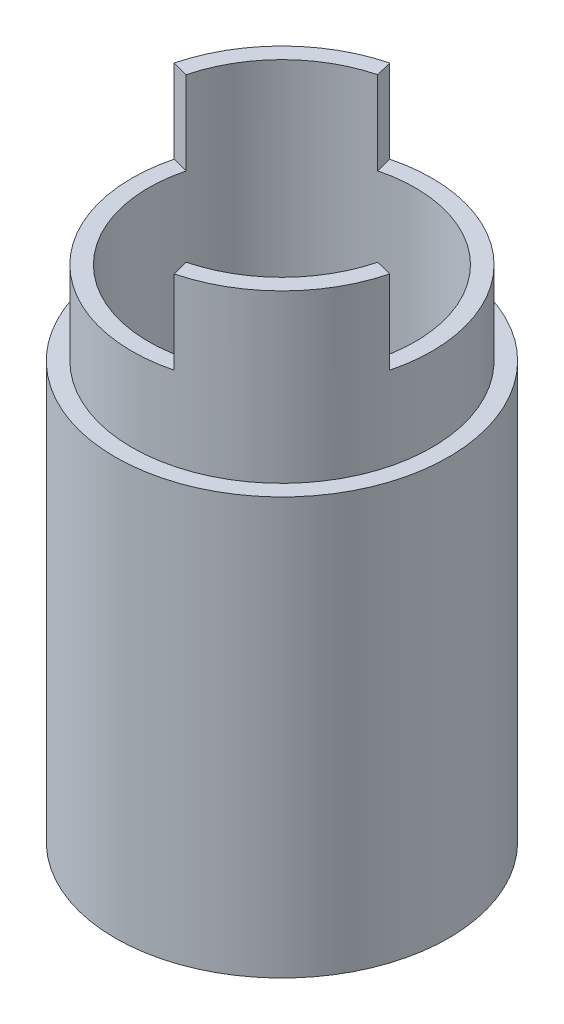
ISO-10303-21;
HEADER;
FILE_DESCRIPTION(('STEP AP214'),'2;1');
FILE_NAME('part.step','',(''),(''),'','','');
FILE_SCHEMA(('AUTOMOTIVE_DESIGN { 1 0 10303 214 1 1 1 1 }'));
ENDSEC;
DATA;
#1=APPLICATION_CONTEXT('core data for automotive mechanical design processes');
#2=APPLICATION_PROTOCOL_DEFINITION('international standard','automotive_design',2000,#1);
#3=PRODUCT_CONTEXT('',#1,'mechanical');
#4=PRODUCT('Part','Part','',(#3));
#5=PRODUCT_RELATED_PRODUCT_CATEGORY('part','',(#4));
#6=PRODUCT_DEFINITION_FORMATION('','',#4);
#7=PRODUCT_DEFINITION_CONTEXT('part definition',#1,'design');
#8=PRODUCT_DEFINITION('design','',#6,#7);
#9=PRODUCT_DEFINITION_SHAPE('','',#8);
#10=(LENGTH_UNIT() NAMED_UNIT(*) SI_UNIT(.MILLI.,.METRE.));
#11=(NAMED_UNIT(*) PLANE_ANGLE_UNIT() SI_UNIT($,.RADIAN.));
#12=(NAMED_UNIT(*) SI_UNIT($,.STERADIAN.) SOLID_ANGLE_UNIT());
#13=UNCERTAINTY_MEASURE_WITH_UNIT(LENGTH_MEASURE(1.E-05),#10,'distance_accuracy_value','');
#14=(GEOMETRIC_REPRESENTATION_CONTEXT(3) GLOBAL_UNCERTAINTY_ASSIGNED_CONTEXT((#13)) GLOBAL_UNIT_ASSIGNED_CONTEXT((#10,
#11,#12)) REPRESENTATION_CONTEXT('',''));
#15=CARTESIAN_POINT('',(0.,0.,0.));
#16=DIRECTION('',(0.,0.,1.));
#17=DIRECTION('',(1.,0.,0.));
#18=AXIS2_PLACEMENT_3D('',#15,#16,#17);
#19=CARTESIAN_POINT('',(0.,60.,0.));
#20=DIRECTION('',(0.,1.,0.));
#21=DIRECTION('',(0.,0.,1.));
#22=AXIS2_PLACEMENT_3D('',#19,#20,#21);
#23=PLANE('',#22);
#24=CARTESIAN_POINT('',(0.,60.,0.));
#25=DIRECTION('',(0.,1.,0.));
#26=DIRECTION('',(0.,0.,1.));
#27=AXIS2_PLACEMENT_3D('',#24,#25,#26);
#28=CIRCLE('',#27,18.);
#29=CARTESIAN_POINT('',(-17.4284250579316,60.,-4.50000000000688));
#30=VERTEX_POINT('',#29);
#31=CARTESIAN_POINT('',(4.49999999999662,60.,17.4284250579342));
#32=VERTEX_POINT('',#31);
#33=EDGE_CURVE('E181',#30,#32,#28,.T.);
#34=ORIENTED_EDGE('',*,*,#33,.T.);
#35=DIRECTION('',(0.249999999999812,0.,0.968245836551903));
#36=VECTOR('',#35,1.);
#37=CARTESIAN_POINT('',(0.,60.,0.));
#38=LINE('',#37,#36);
#39=CARTESIAN_POINT('',(3.999999999997,60.,15.4919333848304));
#40=VERTEX_POINT('',#39);
#41=EDGE_CURVE('E63',#40,#32,#38,.T.);
#42=ORIENTED_EDGE('',*,*,#41,.F.);
#43=CARTESIAN_POINT('',(0.,60.,0.));
#44=DIRECTION('',(0.,1.,0.));
#45=DIRECTION('',(0.,0.,1.));
#46=AXIS2_PLACEMENT_3D('',#43,#44,#45);
#47=CIRCLE('',#46,16.);
#48=CARTESIAN_POINT('',(-15.4919333848297,60.,-4.));
#49=VERTEX_POINT('',#48);
#50=EDGE_CURVE('E177',#49,#40,#47,.T.);
#51=ORIENTED_EDGE('',*,*,#50,.F.);
#52=DIRECTION('',(-0.968245836550966,0.,-0.25000000000344));
#53=VECTOR('',#52,1.);
#54=CARTESIAN_POINT('',(-1.4211071555832E-11,60.,5.50392434666916E-11));
#55=LINE('',#54,#53);
#56=EDGE_CURVE('E139',#49,#30,#55,.T.);
#57=ORIENTED_EDGE('',*,*,#56,.T.);
#58=EDGE_LOOP('',(#34,#42,#51,#57));
#59=FACE_BOUND('',#58,.T.);
#60=ADVANCED_FACE('F39',(#59),#23,.T.);
#61=DIRECTION('',(0.968245836551854,0.,0.25));
#62=VECTOR('',#61,1.);
#63=CARTESIAN_POINT('',(0.,60.,0.));
#64=LINE('',#63,#62);
#65=CARTESIAN_POINT('',(15.4919333848297,60.,4.));
#66=VERTEX_POINT('',#65);
#67=CARTESIAN_POINT('',(17.4284250579352,60.,4.50000000000046));
#68=VERTEX_POINT('',#67);
#69=EDGE_CURVE('E131',#66,#68,#64,.T.);
#70=ORIENTED_EDGE('',*,*,#69,.T.);
#71=CARTESIAN_POINT('',(-4.49999999998974,60.,-17.428425057936));
#72=VERTEX_POINT('',#71);
#73=EDGE_CURVE('E185',#68,#72,#28,.T.);
#74=ORIENTED_EDGE('',*,*,#73,.T.);
#75=DIRECTION('',(0.249999999996372,0.,0.968245836552791));
#76=VECTOR('',#75,1.);
#77=CARTESIAN_POINT('',(-5.50442823831449E-11,60.,1.42123725980372E-11));
#78=LINE('',#77,#76);
#79=CARTESIAN_POINT('',(-3.99999999999657,60.,-15.4919333848288));
#80=VERTEX_POINT('',#79);
#81=EDGE_CURVE('E135',#72,#80,#78,.T.);
#82=ORIENTED_EDGE('',*,*,#81,.T.);
#83=EDGE_CURVE('E55',#66,#80,#47,.T.);
#84=ORIENTED_EDGE('',*,*,#83,.F.);
#85=EDGE_LOOP('',(#70,#74,#82,#84));
#86=FACE_BOUND('',#85,.T.);
#87=ADVANCED_FACE('F207',(#86),#23,.T.);
#88=CARTESIAN_POINT('',(0.,50.,0.));
#89=DIRECTION('',(0.,1.,0.));
#90=DIRECTION('',(0.,0.,1.));
#91=AXIS2_PLACEMENT_3D('',#88,#89,#90);
#92=PLANE('',#91);
#93=CARTESIAN_POINT('',(0.,50.,0.));
#94=DIRECTION('',(0.,1.,0.));
#95=DIRECTION('',(0.,0.,1.));
#96=AXIS2_PLACEMENT_3D('',#93,#94,#95);
#97=CIRCLE('',#96,20.);
#98=CARTESIAN_POINT('',(0.,50.,20.));
#99=VERTEX_POINT('',#98);
#100=EDGE_CURVE('E11',#99,#99,#97,.T.);
#101=ORIENTED_EDGE('',*,*,#100,.T.);
#102=EDGE_LOOP('',(#101));
#103=FACE_BOUND('',#102,.T.);
#104=CARTESIAN_POINT('',(0.,50.,0.));
#105=DIRECTION('',(0.,1.,0.));
#106=DIRECTION('',(0.,0.,1.));
#107=AXIS2_PLACEMENT_3D('',#104,#105,#106);
#108=CIRCLE('',#107,18.);
#109=CARTESIAN_POINT('',(0.,50.,18.));
#110=VERTEX_POINT('',#109);
#111=EDGE_CURVE('E180',#110,#110,#108,.T.);
#112=ORIENTED_EDGE('',*,*,#111,.F.);
#113=EDGE_LOOP('',(#112));
#114=FACE_BOUND('',#113,.T.);
#115=ADVANCED_FACE('F200',(#103,#114),#92,.T.);
#116=CARTESIAN_POINT('',(0.,0.,0.));
#117=DIRECTION('',(0.,1.,0.));
#118=DIRECTION('',(0.,0.,1.));
#119=AXIS2_PLACEMENT_3D('',#116,#117,#118);
#120=PLANE('',#119);
#121=CARTESIAN_POINT('',(0.,0.,0.));
#122=DIRECTION('',(0.,1.,0.));
#123=DIRECTION('',(0.,0.,1.));
#124=AXIS2_PLACEMENT_3D('',#121,#122,#123);
#125=CIRCLE('',#124,20.);
#126=CARTESIAN_POINT('',(0.,0.,20.));
#127=VERTEX_POINT('',#126);
#128=EDGE_CURVE('E43',#127,#127,#125,.T.);
#129=ORIENTED_EDGE('',*,*,#128,.F.);
#130=EDGE_LOOP('',(#129));
#131=FACE_BOUND('',#130,.T.);
#132=CARTESIAN_POINT('',(0.,0.,0.));
#133=DIRECTION('',(0.,1.,0.));
#134=DIRECTION('',(0.,0.,1.));
#135=AXIS2_PLACEMENT_3D('',#132,#133,#134);
#136=CIRCLE('',#135,16.);
#137=CARTESIAN_POINT('',(0.,0.,16.));
#138=VERTEX_POINT('',#137);
#139=EDGE_CURVE('E184',#138,#138,#136,.T.);
#140=ORIENTED_EDGE('',*,*,#139,.T.);
#141=EDGE_LOOP('',(#140));
#142=FACE_BOUND('',#141,.T.);
#143=ADVANCED_FACE('F198',(#131,#142),#120,.F.);
#144=CARTESIAN_POINT('',(0.,50.,0.));
#145=DIRECTION('',(0.,-1.,0.));
#146=DIRECTION('',(0.,0.,-1.));
#147=AXIS2_PLACEMENT_3D('',#144,#145,#146);
#148=CYLINDRICAL_SURFACE('',#147,20.);
#149=ORIENTED_EDGE('',*,*,#100,.F.);
#150=EDGE_LOOP('',(#149));
#151=FACE_BOUND('',#150,.T.);
#152=ORIENTED_EDGE('',*,*,#128,.T.);
#153=EDGE_LOOP('',(#152));
#154=FACE_BOUND('',#153,.T.);
#155=ADVANCED_FACE('F41',(#151,#154),#148,.T.);
#156=CARTESIAN_POINT('',(0.,50.,0.));
#157=DIRECTION('',(0.,-1.,0.));
#158=DIRECTION('',(0.,0.,-1.));
#159=AXIS2_PLACEMENT_3D('',#156,#157,#158);
#160=CYLINDRICAL_SURFACE('',#159,16.);
#161=ORIENTED_EDGE('',*,*,#139,.F.);
#162=EDGE_LOOP('',(#161));
#163=FACE_BOUND('',#162,.T.);
#164=ORIENTED_EDGE('',*,*,#50,.T.);
#165=DIRECTION('',(0.,-1.,0.));
#166=VECTOR('',#165,1.);
#167=CARTESIAN_POINT('',(3.99999999999654,70.,15.4919333848287));
#168=LINE('',#167,#166);
#169=CARTESIAN_POINT('',(3.99999999999654,70.,15.4919333848287));
#170=VERTEX_POINT('',#169);
#171=EDGE_CURVE('E228',#170,#40,#168,.T.);
#172=ORIENTED_EDGE('',*,*,#171,.F.);
#173=CARTESIAN_POINT('',(0.,70.,0.));
#174=DIRECTION('',(0.,1.,0.));
#175=DIRECTION('',(0.,0.,1.));
#176=AXIS2_PLACEMENT_3D('',#173,#174,#175);
#177=CIRCLE('',#176,16.);
#178=CARTESIAN_POINT('',(15.4919333848314,70.,4.00000000000046));
#179=VERTEX_POINT('',#178);
#180=EDGE_CURVE('E127',#170,#179,#177,.T.);
#181=ORIENTED_EDGE('',*,*,#180,.T.);
#182=DIRECTION('',(0.,-1.,0.));
#183=VECTOR('',#182,1.);
#184=CARTESIAN_POINT('',(15.4919333848314,70.,4.00000000000046));
#185=LINE('',#184,#183);
#186=EDGE_CURVE('E141',#179,#66,#185,.T.);
#187=ORIENTED_EDGE('',*,*,#186,.T.);
#188=ORIENTED_EDGE('',*,*,#83,.T.);
#189=DIRECTION('',(0.,-1.,0.));
#190=VECTOR('',#189,1.);
#191=CARTESIAN_POINT('',(-3.99999999999657,70.,-15.4919333848288));
#192=LINE('',#191,#190);
#193=CARTESIAN_POINT('',(-3.99999999999657,70.,-15.4919333848288));
#194=VERTEX_POINT('',#193);
#195=EDGE_CURVE('E159',#194,#80,#192,.T.);
#196=ORIENTED_EDGE('',*,*,#195,.F.);
#197=CARTESIAN_POINT('',(0.,70.,0.));
#198=DIRECTION('',(0.,1.,0.));
#199=DIRECTION('',(0.,0.,1.));
#200=AXIS2_PLACEMENT_3D('',#197,#198,#199);
#201=CIRCLE('',#200,16.);
#202=CARTESIAN_POINT('',(-15.4919333848297,70.,-4.));
#203=VERTEX_POINT('',#202);
#204=EDGE_CURVE('E156',#194,#203,#201,.T.);
#205=ORIENTED_EDGE('',*,*,#204,.T.);
#206=DIRECTION('',(0.,-1.,0.));
#207=VECTOR('',#206,1.);
#208=CARTESIAN_POINT('',(-15.4919333848297,70.,-4.));
#209=LINE('',#208,#207);
#210=EDGE_CURVE('E167',#203,#49,#209,.T.);
#211=ORIENTED_EDGE('',*,*,#210,.T.);
#212=EDGE_LOOP('',(#164,#172,#181,#187,#188,#196,#205,#211));
#213=FACE_BOUND('',#212,.T.);
#214=ADVANCED_FACE('F205',(#163,#213),#160,.F.);
#215=CARTESIAN_POINT('',(0.,60.,0.));
#216=DIRECTION('',(0.,-1.,0.));
#217=DIRECTION('',(0.,0.,-1.));
#218=AXIS2_PLACEMENT_3D('',#215,#216,#217);
#219=CYLINDRICAL_SURFACE('',#218,18.);
#220=ORIENTED_EDGE('',*,*,#33,.F.);
#221=DIRECTION('',(0.,-1.,0.));
#222=VECTOR('',#221,1.);
#223=CARTESIAN_POINT('',(-17.4284250579316,70.,-4.50000000000688));
#224=LINE('',#223,#222);
#225=CARTESIAN_POINT('',(-17.4284250579316,70.,-4.50000000000688));
#226=VERTEX_POINT('',#225);
#227=EDGE_CURVE('E170',#226,#30,#224,.T.);
#228=ORIENTED_EDGE('',*,*,#227,.F.);
#229=CARTESIAN_POINT('',(0.,70.,0.));
#230=DIRECTION('',(0.,1.,0.));
#231=DIRECTION('',(0.,0.,1.));
#232=AXIS2_PLACEMENT_3D('',#229,#230,#231);
#233=CIRCLE('',#232,18.);
#234=CARTESIAN_POINT('',(-4.49999999998974,70.,-17.428425057936));
#235=VERTEX_POINT('',#234);
#236=EDGE_CURVE('E149',#235,#226,#233,.T.);
#237=ORIENTED_EDGE('',*,*,#236,.F.);
#238=DIRECTION('',(0.,-1.,0.));
#239=VECTOR('',#238,1.);
#240=CARTESIAN_POINT('',(-4.49999999998974,70.,-17.428425057936));
#241=LINE('',#240,#239);
#242=EDGE_CURVE('E173',#235,#72,#241,.T.);
#243=ORIENTED_EDGE('',*,*,#242,.T.);
#244=ORIENTED_EDGE('',*,*,#73,.F.);
#245=DIRECTION('',(0.,-1.,0.));
#246=VECTOR('',#245,1.);
#247=CARTESIAN_POINT('',(17.4284250579352,70.,4.50000000000046));
#248=LINE('',#247,#246);
#249=CARTESIAN_POINT('',(17.4284250579352,70.,4.50000000000046));
#250=VERTEX_POINT('',#249);
#251=EDGE_CURVE('E115',#250,#68,#248,.T.);
#252=ORIENTED_EDGE('',*,*,#251,.F.);
#253=CARTESIAN_POINT('',(0.,70.,0.));
#254=DIRECTION('',(0.,1.,0.));
#255=DIRECTION('',(0.,0.,1.));
#256=AXIS2_PLACEMENT_3D('',#253,#254,#255);
#257=CIRCLE('',#256,18.);
#258=CARTESIAN_POINT('',(4.49999999999616,70.,17.4284250579325));
#259=VERTEX_POINT('',#258);
#260=EDGE_CURVE('E107',#259,#250,#257,.T.);
#261=ORIENTED_EDGE('',*,*,#260,.F.);
#262=DIRECTION('',(0.,-1.,0.));
#263=VECTOR('',#262,1.);
#264=CARTESIAN_POINT('',(4.49999999999616,70.,17.4284250579325));
#265=LINE('',#264,#263);
#266=EDGE_CURVE('E113',#259,#32,#265,.T.);
#267=ORIENTED_EDGE('',*,*,#266,.T.);
#268=EDGE_LOOP('',(#220,#228,#237,#243,#244,#252,#261,#267));
#269=FACE_BOUND('',#268,.T.);
#270=ORIENTED_EDGE('',*,*,#111,.T.);
#271=EDGE_LOOP('',(#270));
#272=FACE_BOUND('',#271,.T.);
#273=ADVANCED_FACE('F110',(#269,#272),#219,.T.);
#274=CARTESIAN_POINT('',(-5.50442823831449E-11,70.,1.42123725980372E-11));
#275=DIRECTION('',(0.968245836552791,0.,-0.249999999996372));
#276=DIRECTION('',(-0.249999999996372,0.,-0.968245836552791));
#277=AXIS2_PLACEMENT_3D('',#274,#275,#276);
#278=PLANE('',#277);
#279=ORIENTED_EDGE('',*,*,#81,.F.);
#280=ORIENTED_EDGE('',*,*,#242,.F.);
#281=DIRECTION('',(0.249999999996372,0.,0.968245836552791));
#282=VECTOR('',#281,1.);
#283=CARTESIAN_POINT('',(-5.50442823831449E-11,70.,1.42123725980372E-11));
#284=LINE('',#283,#282);
#285=EDGE_CURVE('E145',#235,#194,#284,.T.);
#286=ORIENTED_EDGE('',*,*,#285,.T.);
#287=ORIENTED_EDGE('',*,*,#195,.T.);
#288=EDGE_LOOP('',(#279,#280,#286,#287));
#289=FACE_BOUND('',#288,.T.);
#290=ADVANCED_FACE('F218',(#289),#278,.T.);
#291=CARTESIAN_POINT('',(-1.4211071555832E-11,70.,5.50392434666916E-11));
#292=DIRECTION('',(-0.25000000000344,0.,0.968245836550966));
#293=DIRECTION('',(0.968245836550966,0.,0.25000000000344));
#294=AXIS2_PLACEMENT_3D('',#291,#292,#293);
#295=PLANE('',#294);
#296=ORIENTED_EDGE('',*,*,#56,.F.);
#297=ORIENTED_EDGE('',*,*,#210,.F.);
#298=DIRECTION('',(-0.968245836550966,0.,-0.25000000000344));
#299=VECTOR('',#298,1.);
#300=CARTESIAN_POINT('',(-1.4211071555832E-11,70.,5.50392434666916E-11));
#301=LINE('',#300,#299);
#302=EDGE_CURVE('E152',#203,#226,#301,.T.);
#303=ORIENTED_EDGE('',*,*,#302,.T.);
#304=ORIENTED_EDGE('',*,*,#227,.T.);
#305=EDGE_LOOP('',(#296,#297,#303,#304));
#306=FACE_BOUND('',#305,.T.);
#307=ADVANCED_FACE('F255',(#306),#295,.T.);
#308=CARTESIAN_POINT('',(0.,70.,0.));
#309=DIRECTION('',(0.,1.,0.));
#310=DIRECTION('',(0.,0.,1.));
#311=AXIS2_PLACEMENT_3D('',#308,#309,#310);
#312=PLANE('',#311);
#313=ORIENTED_EDGE('',*,*,#285,.F.);
#314=ORIENTED_EDGE('',*,*,#236,.T.);
#315=ORIENTED_EDGE('',*,*,#302,.F.);
#316=ORIENTED_EDGE('',*,*,#204,.F.);
#317=EDGE_LOOP('',(#313,#314,#315,#316));
#318=FACE_BOUND('',#317,.T.);
#319=ADVANCED_FACE('F253',(#318),#312,.T.);
#320=CARTESIAN_POINT('',(0.,70.,0.));
#321=DIRECTION('',(0.968245836551903,0.,-0.249999999999812));
#322=DIRECTION('',(-0.249999999999812,0.,-0.968245836551903));
#323=AXIS2_PLACEMENT_3D('',#320,#321,#322);
#324=PLANE('',#323);
#325=ORIENTED_EDGE('',*,*,#41,.T.);
#326=ORIENTED_EDGE('',*,*,#266,.F.);
#327=DIRECTION('',(0.249999999999812,0.,0.968245836551903));
#328=VECTOR('',#327,1.);
#329=CARTESIAN_POINT('',(0.,70.,0.));
#330=LINE('',#329,#328);
#331=EDGE_CURVE('E121',#170,#259,#330,.T.);
#332=ORIENTED_EDGE('',*,*,#331,.F.);
#333=ORIENTED_EDGE('',*,*,#171,.T.);
#334=EDGE_LOOP('',(#325,#326,#332,#333));
#335=FACE_BOUND('',#334,.T.);
#336=ADVANCED_FACE('F133',(#335),#324,.F.);
#337=CARTESIAN_POINT('',(0.,70.,0.));
#338=DIRECTION('',(0.25,0.,-0.968245836551854));
#339=DIRECTION('',(-0.968245836551854,0.,-0.25));
#340=AXIS2_PLACEMENT_3D('',#337,#338,#339);
#341=PLANE('',#340);
#342=ORIENTED_EDGE('',*,*,#69,.F.);
#343=ORIENTED_EDGE('',*,*,#186,.F.);
#344=DIRECTION('',(0.968245836551854,0.,0.25));
#345=VECTOR('',#344,1.);
#346=CARTESIAN_POINT('',(0.,70.,0.));
#347=LINE('',#346,#345);
#348=EDGE_CURVE('E120',#179,#250,#347,.T.);
#349=ORIENTED_EDGE('',*,*,#348,.T.);
#350=ORIENTED_EDGE('',*,*,#251,.T.);
#351=EDGE_LOOP('',(#342,#343,#349,#350));
#352=FACE_BOUND('',#351,.T.);
#353=ADVANCED_FACE('F243',(#352),#341,.T.);
#354=CARTESIAN_POINT('',(0.,70.,0.));
#355=DIRECTION('',(0.,1.,0.));
#356=DIRECTION('',(0.,0.,1.));
#357=AXIS2_PLACEMENT_3D('',#354,#355,#356);
#358=PLANE('',#357);
#359=ORIENTED_EDGE('',*,*,#331,.T.);
#360=ORIENTED_EDGE('',*,*,#260,.T.);
#361=ORIENTED_EDGE('',*,*,#348,.F.);
#362=ORIENTED_EDGE('',*,*,#180,.F.);
#363=EDGE_LOOP('',(#359,#360,#361,#362));
#364=FACE_BOUND('',#363,.T.);
#365=ADVANCED_FACE('F125',(#364),#358,.T.);
#366=CLOSED_SHELL('',(#60,#87,#115,#143,#155,#214,#273,#290,#307,#319,#336,#353,#365));
#367=MANIFOLD_SOLID_BREP('B2',#366);
#368=ADVANCED_BREP_SHAPE_REPRESENTATION('',(#18,#367),#14);
#369=SHAPE_DEFINITION_REPRESENTATION(#9,#368);
ENDSEC;
END-ISO-10303-21;
